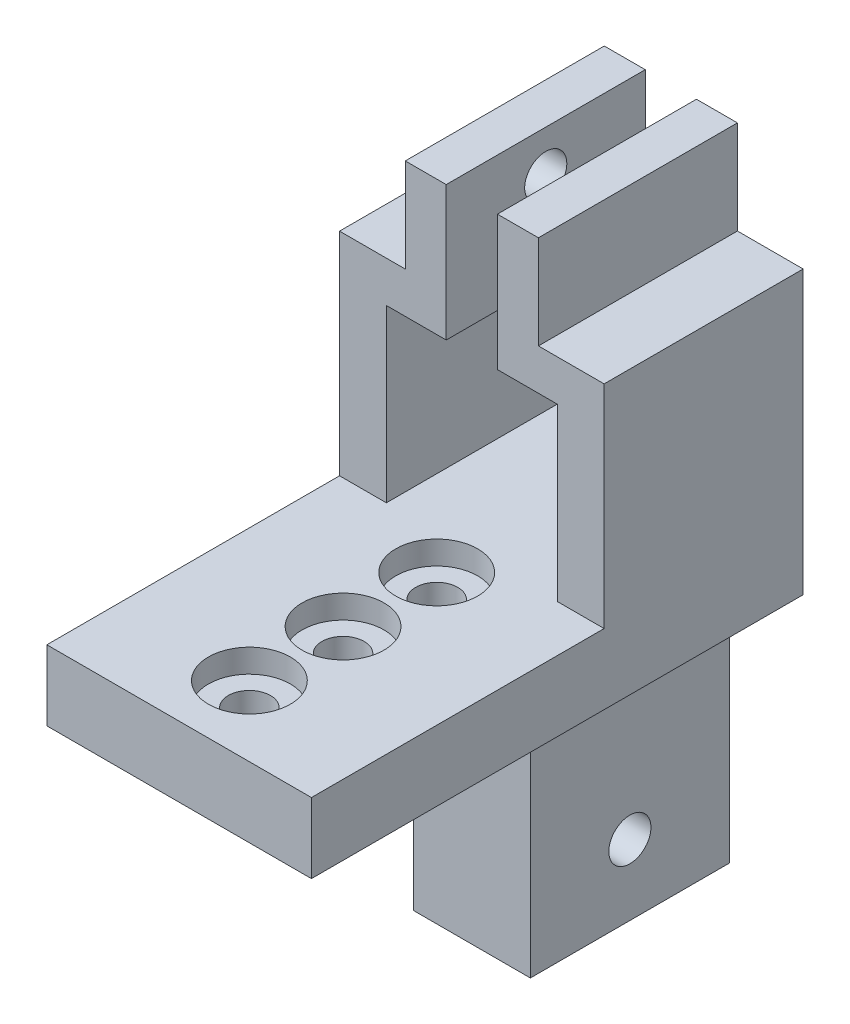
ISO-10303-21;
HEADER;
FILE_DESCRIPTION(('STEP AP214'),'2;1');
FILE_NAME('part.step','',(''),(''),'','','');
FILE_SCHEMA(('AUTOMOTIVE_DESIGN { 1 0 10303 214 1 1 1 1 }'));
ENDSEC;
DATA;
#1=APPLICATION_CONTEXT('core data for automotive mechanical design processes');
#2=APPLICATION_PROTOCOL_DEFINITION('international standard','automotive_design',2000,#1);
#3=PRODUCT_CONTEXT('',#1,'mechanical');
#4=PRODUCT('Part','Part','',(#3));
#5=PRODUCT_RELATED_PRODUCT_CATEGORY('part','',(#4));
#6=PRODUCT_DEFINITION_FORMATION('','',#4);
#7=PRODUCT_DEFINITION_CONTEXT('part definition',#1,'design');
#8=PRODUCT_DEFINITION('design','',#6,#7);
#9=PRODUCT_DEFINITION_SHAPE('','',#8);
#10=(LENGTH_UNIT() NAMED_UNIT(*) SI_UNIT(.MILLI.,.METRE.));
#11=(NAMED_UNIT(*) PLANE_ANGLE_UNIT() SI_UNIT($,.RADIAN.));
#12=(NAMED_UNIT(*) SI_UNIT($,.STERADIAN.) SOLID_ANGLE_UNIT());
#13=UNCERTAINTY_MEASURE_WITH_UNIT(LENGTH_MEASURE(1.E-05),#10,'distance_accuracy_value','');
#14=(GEOMETRIC_REPRESENTATION_CONTEXT(3) GLOBAL_UNCERTAINTY_ASSIGNED_CONTEXT((#13)) GLOBAL_UNIT_ASSIGNED_CONTEXT((#10,
#11,#12)) REPRESENTATION_CONTEXT('',''));
#15=CARTESIAN_POINT('',(0.,0.,0.));
#16=DIRECTION('',(0.,0.,1.));
#17=DIRECTION('',(1.,0.,0.));
#18=AXIS2_PLACEMENT_3D('',#15,#16,#17);
#19=CARTESIAN_POINT('',(-0.226296722125636,-34.1399860487917,20.));
#20=DIRECTION('',(0.,1.,0.));
#21=DIRECTION('',(-1.,0.,0.));
#22=AXIS2_PLACEMENT_3D('',#19,#20,#21);
#23=CYLINDRICAL_SURFACE('',#22,1.8);
#24=CARTESIAN_POINT('',(-0.226296722125634,-11.1399610487917,20.));
#25=DIRECTION('',(0.,1.,0.));
#26=DIRECTION('',(0.,0.,1.));
#27=AXIS2_PLACEMENT_3D('',#24,#25,#26);
#28=CIRCLE('',#27,1.8);
#29=CARTESIAN_POINT('',(-0.226296722125634,-11.1399610487917,21.8));
#30=VERTEX_POINT('',#29);
#31=EDGE_CURVE('E264',#30,#30,#28,.T.);
#32=ORIENTED_EDGE('',*,*,#31,.F.);
#33=EDGE_LOOP('',(#32));
#34=FACE_BOUND('',#33,.T.);
#35=CARTESIAN_POINT('',(-0.226296722125634,-7.13996104879168,20.));
#36=DIRECTION('',(0.,1.,0.));
#37=DIRECTION('',(-1.,0.,0.));
#38=AXIS2_PLACEMENT_3D('',#35,#36,#37);
#39=CIRCLE('',#38,1.8);
#40=CARTESIAN_POINT('',(-2.02629672212563,-7.13996104879168,20.));
#41=VERTEX_POINT('',#40);
#42=EDGE_CURVE('E39',#41,#41,#39,.F.);
#43=ORIENTED_EDGE('',*,*,#42,.F.);
#44=EDGE_LOOP('',(#43));
#45=FACE_BOUND('',#44,.T.);
#46=ADVANCED_FACE('F35',(#34,#45),#23,.F.);
#47=CARTESIAN_POINT('',(-0.226296722125636,-34.1399860487917,28.));
#48=DIRECTION('',(0.,1.,0.));
#49=DIRECTION('',(-1.,0.,0.));
#50=AXIS2_PLACEMENT_3D('',#47,#48,#49);
#51=CYLINDRICAL_SURFACE('',#50,1.8);
#52=CARTESIAN_POINT('',(-0.226296722125634,-11.1399610487917,28.));
#53=DIRECTION('',(0.,1.,0.));
#54=DIRECTION('',(0.,0.,1.));
#55=AXIS2_PLACEMENT_3D('',#52,#53,#54);
#56=CIRCLE('',#55,1.8);
#57=CARTESIAN_POINT('',(-0.226296722125634,-11.1399610487917,29.8));
#58=VERTEX_POINT('',#57);
#59=EDGE_CURVE('E288',#58,#58,#56,.T.);
#60=ORIENTED_EDGE('',*,*,#59,.F.);
#61=EDGE_LOOP('',(#60));
#62=FACE_BOUND('',#61,.T.);
#63=CARTESIAN_POINT('',(-0.226296722125634,-7.13996104879168,28.));
#64=DIRECTION('',(0.,1.,0.));
#65=DIRECTION('',(-1.,0.,0.));
#66=AXIS2_PLACEMENT_3D('',#63,#64,#65);
#67=CIRCLE('',#66,1.8);
#68=CARTESIAN_POINT('',(-2.02629672212563,-7.13996104879168,28.));
#69=VERTEX_POINT('',#68);
#70=EDGE_CURVE('E266',#69,#69,#67,.F.);
#71=ORIENTED_EDGE('',*,*,#70,.F.);
#72=EDGE_LOOP('',(#71));
#73=FACE_BOUND('',#72,.T.);
#74=ADVANCED_FACE('F300',(#62,#73),#51,.F.);
#75=CARTESIAN_POINT('',(-0.226296722125636,-34.1399860487917,36.));
#76=DIRECTION('',(0.,1.,0.));
#77=DIRECTION('',(-1.,0.,0.));
#78=AXIS2_PLACEMENT_3D('',#75,#76,#77);
#79=CYLINDRICAL_SURFACE('',#78,1.8);
#80=CARTESIAN_POINT('',(-0.226296722125634,-11.1399610487917,36.));
#81=DIRECTION('',(0.,1.,0.));
#82=DIRECTION('',(0.,0.,1.));
#83=AXIS2_PLACEMENT_3D('',#80,#81,#82);
#84=CIRCLE('',#83,1.8);
#85=CARTESIAN_POINT('',(-0.226296722125634,-11.1399610487917,37.8));
#86=VERTEX_POINT('',#85);
#87=EDGE_CURVE('E213',#86,#86,#84,.T.);
#88=ORIENTED_EDGE('',*,*,#87,.F.);
#89=EDGE_LOOP('',(#88));
#90=FACE_BOUND('',#89,.T.);
#91=CARTESIAN_POINT('',(-0.226296722125634,-7.13996104879168,36.));
#92=DIRECTION('',(0.,1.,0.));
#93=DIRECTION('',(-1.,0.,0.));
#94=AXIS2_PLACEMENT_3D('',#91,#92,#93);
#95=CIRCLE('',#94,1.8);
#96=CARTESIAN_POINT('',(-2.02629672212564,-7.13996104879168,36.));
#97=VERTEX_POINT('',#96);
#98=EDGE_CURVE('E262',#97,#97,#95,.F.);
#99=ORIENTED_EDGE('',*,*,#98,.F.);
#100=EDGE_LOOP('',(#99));
#101=FACE_BOUND('',#100,.T.);
#102=ADVANCED_FACE('F296',(#90,#101),#79,.F.);
#103=CARTESIAN_POINT('',(0.,0.,17.));
#104=DIRECTION('',(0.,0.,-1.));
#105=DIRECTION('',(-1.,0.,0.));
#106=AXIS2_PLACEMENT_3D('',#103,#104,#105);
#107=PLANE('',#106);
#108=DIRECTION('',(-1.,0.,0.));
#109=VECTOR('',#108,1.);
#110=CARTESIAN_POINT('',(-11.5262967221256,-5.13996104879168,17.));
#111=LINE('',#110,#109);
#112=CARTESIAN_POINT('',(11.0737032778744,-5.13996104879168,17.));
#113=VERTEX_POINT('',#112);
#114=CARTESIAN_POINT('',(7.07370327787437,-5.13996104879168,17.));
#115=VERTEX_POINT('',#114);
#116=EDGE_CURVE('E52',#113,#115,#111,.T.);
#117=ORIENTED_EDGE('',*,*,#116,.F.);
#118=DIRECTION('',(0.,1.,0.));
#119=VECTOR('',#118,1.);
#120=CARTESIAN_POINT('',(11.0737032778744,-11.1399610487917,17.));
#121=LINE('',#120,#119);
#122=CARTESIAN_POINT('',(11.0737032778744,12.9600389512083,17.));
#123=VERTEX_POINT('',#122);
#124=EDGE_CURVE('E228',#113,#123,#121,.T.);
#125=ORIENTED_EDGE('',*,*,#124,.T.);
#126=DIRECTION('',(-1.,0.,0.));
#127=VECTOR('',#126,1.);
#128=CARTESIAN_POINT('',(11.0737032778744,12.9600389512083,17.));
#129=LINE('',#128,#127);
#130=CARTESIAN_POINT('',(5.46031730207638,12.9600389512083,17.));
#131=VERTEX_POINT('',#130);
#132=EDGE_CURVE('E511',#123,#131,#129,.T.);
#133=ORIENTED_EDGE('',*,*,#132,.T.);
#134=DIRECTION('',(0.,1.,0.));
#135=VECTOR('',#134,1.);
#136=CARTESIAN_POINT('',(5.46031730207638,20.9600389512083,17.));
#137=LINE('',#136,#135);
#138=CARTESIAN_POINT('',(5.46031730207638,20.9600389512083,17.));
#139=VERTEX_POINT('',#138);
#140=EDGE_CURVE('E522',#131,#139,#137,.T.);
#141=ORIENTED_EDGE('',*,*,#140,.T.);
#142=DIRECTION('',(-1.,0.,0.));
#143=VECTOR('',#142,1.);
#144=CARTESIAN_POINT('',(1.96031730207638,20.9600389512083,17.));
#145=LINE('',#144,#143);
#146=CARTESIAN_POINT('',(1.96031730207638,20.9600389512083,17.));
#147=VERTEX_POINT('',#146);
#148=EDGE_CURVE('E519',#139,#147,#145,.T.);
#149=ORIENTED_EDGE('',*,*,#148,.T.);
#150=DIRECTION('',(0.,-1.,0.));
#151=VECTOR('',#150,1.);
#152=CARTESIAN_POINT('',(1.96031730207638,9.46003895120832,17.));
#153=LINE('',#152,#151);
#154=CARTESIAN_POINT('',(1.96031730207638,9.46003895120832,17.));
#155=VERTEX_POINT('',#154);
#156=EDGE_CURVE('E521',#147,#155,#153,.T.);
#157=ORIENTED_EDGE('',*,*,#156,.T.);
#158=DIRECTION('',(1.,0.,0.));
#159=VECTOR('',#158,1.);
#160=CARTESIAN_POINT('',(7.07370327787437,9.46003895120832,17.));
#161=LINE('',#160,#159);
#162=CARTESIAN_POINT('',(7.07370327787437,9.46003895120832,17.));
#163=VERTEX_POINT('',#162);
#164=EDGE_CURVE('E249',#155,#163,#161,.T.);
#165=ORIENTED_EDGE('',*,*,#164,.T.);
#166=DIRECTION('',(0.,-1.,0.));
#167=VECTOR('',#166,1.);
#168=CARTESIAN_POINT('',(7.07370327787437,-5.13996104879168,17.));
#169=LINE('',#168,#167);
#170=EDGE_CURVE('E245',#163,#115,#169,.T.);
#171=ORIENTED_EDGE('',*,*,#170,.T.);
#172=EDGE_LOOP('',(#117,#125,#133,#141,#149,#157,#165,#171));
#173=FACE_BOUND('',#172,.T.);
#174=ADVANCED_FACE('F299',(#173),#107,.F.);
#175=CARTESIAN_POINT('',(-7.52629672212563,-5.13996104879168,17.));
#176=VERTEX_POINT('',#175);
#177=CARTESIAN_POINT('',(-11.5262967221256,-5.13996104879168,17.));
#178=VERTEX_POINT('',#177);
#179=EDGE_CURVE('E11',#176,#178,#111,.T.);
#180=ORIENTED_EDGE('',*,*,#179,.F.);
#181=DIRECTION('',(0.,1.,0.));
#182=VECTOR('',#181,1.);
#183=CARTESIAN_POINT('',(-7.52629672212563,9.46003895120832,17.));
#184=LINE('',#183,#182);
#185=CARTESIAN_POINT('',(-7.52629672212563,9.46003895120832,17.));
#186=VERTEX_POINT('',#185);
#187=EDGE_CURVE('E243',#176,#186,#184,.T.);
#188=ORIENTED_EDGE('',*,*,#187,.T.);
#189=DIRECTION('',(1.,0.,0.));
#190=VECTOR('',#189,1.);
#191=CARTESIAN_POINT('',(-7.52629672212563,9.46003895120832,17.));
#192=LINE('',#191,#190);
#193=CARTESIAN_POINT('',(-2.41291074632765,9.46003895120832,17.));
#194=VERTEX_POINT('',#193);
#195=EDGE_CURVE('E492',#186,#194,#192,.T.);
#196=ORIENTED_EDGE('',*,*,#195,.T.);
#197=DIRECTION('',(0.,1.,0.));
#198=VECTOR('',#197,1.);
#199=CARTESIAN_POINT('',(-2.41291074632765,20.9600389512083,17.));
#200=LINE('',#199,#198);
#201=CARTESIAN_POINT('',(-2.41291074632765,20.9600389512083,17.));
#202=VERTEX_POINT('',#201);
#203=EDGE_CURVE('E544',#194,#202,#200,.T.);
#204=ORIENTED_EDGE('',*,*,#203,.T.);
#205=DIRECTION('',(-1.,0.,0.));
#206=VECTOR('',#205,1.);
#207=CARTESIAN_POINT('',(-5.91291074632765,20.9600389512083,17.));
#208=LINE('',#207,#206);
#209=CARTESIAN_POINT('',(-5.91291074632765,20.9600389512083,17.));
#210=VERTEX_POINT('',#209);
#211=EDGE_CURVE('E440',#202,#210,#208,.T.);
#212=ORIENTED_EDGE('',*,*,#211,.T.);
#213=DIRECTION('',(0.,-1.,0.));
#214=VECTOR('',#213,1.);
#215=CARTESIAN_POINT('',(-5.91291074632765,12.9600389512083,17.));
#216=LINE('',#215,#214);
#217=CARTESIAN_POINT('',(-5.91291074632765,12.9600389512083,17.));
#218=VERTEX_POINT('',#217);
#219=EDGE_CURVE('E547',#210,#218,#216,.T.);
#220=ORIENTED_EDGE('',*,*,#219,.T.);
#221=DIRECTION('',(-1.,0.,0.));
#222=VECTOR('',#221,1.);
#223=CARTESIAN_POINT('',(-5.91291074632765,12.9600389512083,17.));
#224=LINE('',#223,#222);
#225=CARTESIAN_POINT('',(-11.5262967221256,12.9600389512083,17.));
#226=VERTEX_POINT('',#225);
#227=EDGE_CURVE('E549',#218,#226,#224,.T.);
#228=ORIENTED_EDGE('',*,*,#227,.T.);
#229=DIRECTION('',(0.,-1.,0.));
#230=VECTOR('',#229,1.);
#231=CARTESIAN_POINT('',(-11.5262967221256,12.9600389512083,17.));
#232=LINE('',#231,#230);
#233=EDGE_CURVE('E60',#226,#178,#232,.T.);
#234=ORIENTED_EDGE('',*,*,#233,.T.);
#235=EDGE_LOOP('',(#180,#188,#196,#204,#212,#220,#228,#234));
#236=FACE_BOUND('',#235,.T.);
#237=ADVANCED_FACE('F357',(#236),#107,.F.);
#238=DIRECTION('',(1.,0.,0.));
#239=VECTOR('',#238,1.);
#240=CARTESIAN_POINT('',(-11.5262967221256,-11.1399610487917,17.));
#241=LINE('',#240,#239);
#242=CARTESIAN_POINT('',(-5.22629672212564,-11.1399610487917,17.));
#243=VERTEX_POINT('',#242);
#244=CARTESIAN_POINT('',(4.77370327787437,-11.1399610487917,17.));
#245=VERTEX_POINT('',#244);
#246=EDGE_CURVE('E44',#243,#245,#241,.T.);
#247=ORIENTED_EDGE('',*,*,#246,.F.);
#248=DIRECTION('',(0.,-1.,0.));
#249=VECTOR('',#248,1.);
#250=CARTESIAN_POINT('',(-5.22629672212564,-11.1399610487917,17.));
#251=LINE('',#250,#249);
#252=CARTESIAN_POINT('',(-5.22629672212563,-34.1399610487917,17.));
#253=VERTEX_POINT('',#252);
#254=EDGE_CURVE('E561',#243,#253,#251,.T.);
#255=ORIENTED_EDGE('',*,*,#254,.T.);
#256=DIRECTION('',(1.,0.,0.));
#257=VECTOR('',#256,1.);
#258=CARTESIAN_POINT('',(-5.22629672212563,-34.1399610487917,17.));
#259=LINE('',#258,#257);
#260=CARTESIAN_POINT('',(4.77370327787437,-34.1399610487917,17.));
#261=VERTEX_POINT('',#260);
#262=EDGE_CURVE('E569',#253,#261,#259,.T.);
#263=ORIENTED_EDGE('',*,*,#262,.T.);
#264=DIRECTION('',(0.,1.,0.));
#265=VECTOR('',#264,1.);
#266=CARTESIAN_POINT('',(4.77370327787437,-11.1399610487917,17.));
#267=LINE('',#266,#265);
#268=EDGE_CURVE('E565',#261,#245,#267,.T.);
#269=ORIENTED_EDGE('',*,*,#268,.T.);
#270=EDGE_LOOP('',(#247,#255,#263,#269));
#271=FACE_BOUND('',#270,.T.);
#272=ADVANCED_FACE('F358',(#271),#107,.F.);
#273=CARTESIAN_POINT('',(-7.52629672212563,9.46003895120832,17.));
#274=DIRECTION('',(0.,1.,0.));
#275=DIRECTION('',(0.,0.,1.));
#276=AXIS2_PLACEMENT_3D('',#273,#274,#275);
#277=PLANE('',#276);
#278=DIRECTION('',(1.,0.,0.));
#279=VECTOR('',#278,1.);
#280=CARTESIAN_POINT('',(-7.52629672212563,9.46003895120832,0.));
#281=LINE('',#280,#279);
#282=CARTESIAN_POINT('',(-7.52629672212563,9.46003895120832,0.));
#283=VERTEX_POINT('',#282);
#284=CARTESIAN_POINT('',(-2.41291074632765,9.46003895120832,0.));
#285=VERTEX_POINT('',#284);
#286=EDGE_CURVE('E436',#283,#285,#281,.T.);
#287=ORIENTED_EDGE('',*,*,#286,.T.);
#288=DIRECTION('',(0.,0.,-1.));
#289=VECTOR('',#288,1.);
#290=CARTESIAN_POINT('',(-2.41291074632765,9.46003895120832,17.));
#291=LINE('',#290,#289);
#292=EDGE_CURVE('E227',#194,#285,#291,.T.);
#293=ORIENTED_EDGE('',*,*,#292,.F.);
#294=ORIENTED_EDGE('',*,*,#195,.F.);
#295=DIRECTION('',(0.,0.,-1.));
#296=VECTOR('',#295,1.);
#297=CARTESIAN_POINT('',(-7.52629672212563,9.46003895120832,17.));
#298=LINE('',#297,#296);
#299=EDGE_CURVE('E240',#186,#283,#298,.T.);
#300=ORIENTED_EDGE('',*,*,#299,.T.);
#301=EDGE_LOOP('',(#287,#293,#294,#300));
#302=FACE_BOUND('',#301,.T.);
#303=ADVANCED_FACE('F37',(#302),#277,.F.);
#304=CARTESIAN_POINT('',(-2.41291074632765,20.9600389512083,17.));
#305=DIRECTION('',(-1.,0.,0.));
#306=DIRECTION('',(0.,-1.,0.));
#307=AXIS2_PLACEMENT_3D('',#304,#305,#306);
#308=PLANE('',#307);
#309=CARTESIAN_POINT('',(-2.41291074632765,17.3600389512083,8.5));
#310=DIRECTION('',(-1.,0.,0.));
#311=DIRECTION('',(0.,-1.,0.));
#312=AXIS2_PLACEMENT_3D('',#309,#310,#311);
#313=CIRCLE('',#312,1.8);
#314=CARTESIAN_POINT('',(-2.41291074632765,15.5600389512083,8.5));
#315=VERTEX_POINT('',#314);
#316=EDGE_CURVE('E424',#315,#315,#313,.T.);
#317=ORIENTED_EDGE('',*,*,#316,.T.);
#318=EDGE_LOOP('',(#317));
#319=FACE_BOUND('',#318,.T.);
#320=DIRECTION('',(0.,1.,0.));
#321=VECTOR('',#320,1.);
#322=CARTESIAN_POINT('',(-2.41291074632765,20.9600389512083,0.));
#323=LINE('',#322,#321);
#324=CARTESIAN_POINT('',(-2.41291074632765,20.9600389512083,0.));
#325=VERTEX_POINT('',#324);
#326=EDGE_CURVE('E427',#285,#325,#323,.T.);
#327=ORIENTED_EDGE('',*,*,#326,.T.);
#328=DIRECTION('',(0.,0.,-1.));
#329=VECTOR('',#328,1.);
#330=CARTESIAN_POINT('',(-2.41291074632765,20.9600389512083,17.));
#331=LINE('',#330,#329);
#332=EDGE_CURVE('E429',#202,#325,#331,.T.);
#333=ORIENTED_EDGE('',*,*,#332,.F.);
#334=ORIENTED_EDGE('',*,*,#203,.F.);
#335=ORIENTED_EDGE('',*,*,#292,.T.);
#336=EDGE_LOOP('',(#327,#333,#334,#335));
#337=FACE_BOUND('',#336,.T.);
#338=ADVANCED_FACE('F413',(#319,#337),#308,.F.);
#339=CARTESIAN_POINT('',(-5.91291074632765,20.9600389512083,17.));
#340=DIRECTION('',(0.,-1.,0.));
#341=DIRECTION('',(0.,0.,-1.));
#342=AXIS2_PLACEMENT_3D('',#339,#340,#341);
#343=PLANE('',#342);
#344=DIRECTION('',(-1.,0.,0.));
#345=VECTOR('',#344,1.);
#346=CARTESIAN_POINT('',(-5.91291074632765,20.9600389512083,0.));
#347=LINE('',#346,#345);
#348=CARTESIAN_POINT('',(-5.91291074632765,20.9600389512083,0.));
#349=VERTEX_POINT('',#348);
#350=EDGE_CURVE('E435',#325,#349,#347,.T.);
#351=ORIENTED_EDGE('',*,*,#350,.T.);
#352=DIRECTION('',(0.,0.,-1.));
#353=VECTOR('',#352,1.);
#354=CARTESIAN_POINT('',(-5.91291074632765,20.9600389512083,17.));
#355=LINE('',#354,#353);
#356=EDGE_CURVE('E441',#210,#349,#355,.T.);
#357=ORIENTED_EDGE('',*,*,#356,.F.);
#358=ORIENTED_EDGE('',*,*,#211,.F.);
#359=ORIENTED_EDGE('',*,*,#332,.T.);
#360=EDGE_LOOP('',(#351,#357,#358,#359));
#361=FACE_BOUND('',#360,.T.);
#362=ADVANCED_FACE('F410',(#361),#343,.F.);
#363=CARTESIAN_POINT('',(-5.91291074632765,12.9600389512083,17.));
#364=DIRECTION('',(1.,0.,0.));
#365=DIRECTION('',(0.,0.,-1.));
#366=AXIS2_PLACEMENT_3D('',#363,#364,#365);
#367=PLANE('',#366);
#368=CARTESIAN_POINT('',(-5.91291074632765,17.3600389512083,8.5));
#369=DIRECTION('',(1.,0.,0.));
#370=DIRECTION('',(0.,0.,-1.));
#371=AXIS2_PLACEMENT_3D('',#368,#369,#370);
#372=CIRCLE('',#371,1.8);
#373=CARTESIAN_POINT('',(-5.91291074632765,17.3600389512083,6.7));
#374=VERTEX_POINT('',#373);
#375=EDGE_CURVE('E557',#374,#374,#372,.T.);
#376=ORIENTED_EDGE('',*,*,#375,.T.);
#377=EDGE_LOOP('',(#376));
#378=FACE_BOUND('',#377,.T.);
#379=DIRECTION('',(0.,-1.,0.));
#380=VECTOR('',#379,1.);
#381=CARTESIAN_POINT('',(-5.91291074632765,12.9600389512083,0.));
#382=LINE('',#381,#380);
#383=CARTESIAN_POINT('',(-5.91291074632765,12.9600389512083,0.));
#384=VERTEX_POINT('',#383);
#385=EDGE_CURVE('E445',#349,#384,#382,.T.);
#386=ORIENTED_EDGE('',*,*,#385,.T.);
#387=DIRECTION('',(0.,0.,-1.));
#388=VECTOR('',#387,1.);
#389=CARTESIAN_POINT('',(-5.91291074632765,12.9600389512083,17.));
#390=LINE('',#389,#388);
#391=EDGE_CURVE('E466',#218,#384,#390,.T.);
#392=ORIENTED_EDGE('',*,*,#391,.F.);
#393=ORIENTED_EDGE('',*,*,#219,.F.);
#394=ORIENTED_EDGE('',*,*,#356,.T.);
#395=EDGE_LOOP('',(#386,#392,#393,#394));
#396=FACE_BOUND('',#395,.T.);
#397=ADVANCED_FACE('F406',(#378,#396),#367,.F.);
#398=CARTESIAN_POINT('',(-5.91291074632765,12.9600389512083,17.));
#399=DIRECTION('',(0.,-1.,0.));
#400=DIRECTION('',(0.,0.,-1.));
#401=AXIS2_PLACEMENT_3D('',#398,#399,#400);
#402=PLANE('',#401);
#403=DIRECTION('',(-1.,0.,0.));
#404=VECTOR('',#403,1.);
#405=CARTESIAN_POINT('',(-5.91291074632765,12.9600389512083,0.));
#406=LINE('',#405,#404);
#407=CARTESIAN_POINT('',(-11.5262967221256,12.9600389512083,0.));
#408=VERTEX_POINT('',#407);
#409=EDGE_CURVE('E447',#384,#408,#406,.T.);
#410=ORIENTED_EDGE('',*,*,#409,.T.);
#411=DIRECTION('',(0.,0.,-1.));
#412=VECTOR('',#411,1.);
#413=CARTESIAN_POINT('',(-11.5262967221256,12.9600389512083,17.));
#414=LINE('',#413,#412);
#415=EDGE_CURVE('E197',#226,#408,#414,.T.);
#416=ORIENTED_EDGE('',*,*,#415,.F.);
#417=ORIENTED_EDGE('',*,*,#227,.F.);
#418=ORIENTED_EDGE('',*,*,#391,.T.);
#419=EDGE_LOOP('',(#410,#416,#417,#418));
#420=FACE_BOUND('',#419,.T.);
#421=ADVANCED_FACE('F403',(#420),#402,.F.);
#422=CARTESIAN_POINT('',(-11.5262967221256,12.9600389512083,17.));
#423=DIRECTION('',(1.,0.,0.));
#424=DIRECTION('',(0.,1.,0.));
#425=AXIS2_PLACEMENT_3D('',#422,#423,#424);
#426=PLANE('',#425);
#427=DIRECTION('',(0.,-1.,0.));
#428=VECTOR('',#427,1.);
#429=CARTESIAN_POINT('',(-11.5262967221256,12.9600389512083,0.));
#430=LINE('',#429,#428);
#431=CARTESIAN_POINT('',(-11.5262967221256,-11.1399610487917,0.));
#432=VERTEX_POINT('',#431);
#433=EDGE_CURVE('E193',#408,#432,#430,.T.);
#434=ORIENTED_EDGE('',*,*,#433,.T.);
#435=DIRECTION('',(0.,0.,-1.));
#436=VECTOR('',#435,1.);
#437=CARTESIAN_POINT('',(-11.5262967221256,-11.1399610487917,17.));
#438=LINE('',#437,#436);
#439=CARTESIAN_POINT('',(-11.5262967221256,-11.1399610487917,42.));
#440=VERTEX_POINT('',#439);
#441=EDGE_CURVE('E185',#440,#432,#438,.T.);
#442=ORIENTED_EDGE('',*,*,#441,.F.);
#443=DIRECTION('',(0.,-1.,0.));
#444=VECTOR('',#443,1.);
#445=CARTESIAN_POINT('',(-11.5262967221256,-11.1399610487917,42.));
#446=LINE('',#445,#444);
#447=CARTESIAN_POINT('',(-11.5262967221256,-5.13996104879168,42.));
#448=VERTEX_POINT('',#447);
#449=EDGE_CURVE('E190',#448,#440,#446,.T.);
#450=ORIENTED_EDGE('',*,*,#449,.F.);
#451=DIRECTION('',(0.,0.,-1.));
#452=VECTOR('',#451,1.);
#453=CARTESIAN_POINT('',(-11.5262967221256,-5.13996104879168,42.));
#454=LINE('',#453,#452);
#455=EDGE_CURVE('E220',#448,#178,#454,.T.);
#456=ORIENTED_EDGE('',*,*,#455,.T.);
#457=ORIENTED_EDGE('',*,*,#233,.F.);
#458=ORIENTED_EDGE('',*,*,#415,.T.);
#459=EDGE_LOOP('',(#434,#442,#450,#456,#457,#458));
#460=FACE_BOUND('',#459,.T.);
#461=ADVANCED_FACE('F187',(#460),#426,.F.);
#462=CARTESIAN_POINT('',(-11.5262967221256,-11.1399610487917,17.));
#463=DIRECTION('',(0.,1.,0.));
#464=DIRECTION('',(0.,0.,1.));
#465=AXIS2_PLACEMENT_3D('',#462,#463,#464);
#466=PLANE('',#465);
#467=ORIENTED_EDGE('',*,*,#31,.T.);
#468=EDGE_LOOP('',(#467));
#469=FACE_BOUND('',#468,.T.);
#470=ORIENTED_EDGE('',*,*,#59,.T.);
#471=EDGE_LOOP('',(#470));
#472=FACE_BOUND('',#471,.T.);
#473=ORIENTED_EDGE('',*,*,#87,.T.);
#474=EDGE_LOOP('',(#473));
#475=FACE_BOUND('',#474,.T.);
#476=DIRECTION('',(1.,0.,0.));
#477=VECTOR('',#476,1.);
#478=CARTESIAN_POINT('',(-11.5262967221256,-11.1399610487917,0.));
#479=LINE('',#478,#477);
#480=CARTESIAN_POINT('',(-5.22629672212564,-11.1399610487917,0.));
#481=VERTEX_POINT('',#480);
#482=EDGE_CURVE('E462',#432,#481,#479,.T.);
#483=ORIENTED_EDGE('',*,*,#482,.T.);
#484=DIRECTION('',(0.,0.,1.));
#485=VECTOR('',#484,1.);
#486=CARTESIAN_POINT('',(-5.22629672212564,-11.1399610487917,-25.0798724079689));
#487=LINE('',#486,#485);
#488=EDGE_CURVE('E536',#481,#243,#487,.T.);
#489=ORIENTED_EDGE('',*,*,#488,.T.);
#490=ORIENTED_EDGE('',*,*,#246,.T.);
#491=DIRECTION('',(0.,0.,1.));
#492=VECTOR('',#491,1.);
#493=CARTESIAN_POINT('',(4.77370327787437,-11.1399610487917,-25.0798724079689));
#494=LINE('',#493,#492);
#495=CARTESIAN_POINT('',(4.77370327787437,-11.1399610487917,0.));
#496=VERTEX_POINT('',#495);
#497=EDGE_CURVE('E574',#496,#245,#494,.T.);
#498=ORIENTED_EDGE('',*,*,#497,.F.);
#499=CARTESIAN_POINT('',(11.0737032778744,-11.1399610487917,0.));
#500=VERTEX_POINT('',#499);
#501=EDGE_CURVE('E453',#496,#500,#479,.T.);
#502=ORIENTED_EDGE('',*,*,#501,.T.);
#503=DIRECTION('',(0.,0.,-1.));
#504=VECTOR('',#503,1.);
#505=CARTESIAN_POINT('',(11.0737032778744,-11.1399610487917,17.));
#506=LINE('',#505,#504);
#507=CARTESIAN_POINT('',(11.0737032778744,-11.1399610487917,42.));
#508=VERTEX_POINT('',#507);
#509=EDGE_CURVE('E198',#508,#500,#506,.T.);
#510=ORIENTED_EDGE('',*,*,#509,.F.);
#511=DIRECTION('',(1.,0.,0.));
#512=VECTOR('',#511,1.);
#513=CARTESIAN_POINT('',(-11.5262967221256,-11.1399610487917,42.));
#514=LINE('',#513,#512);
#515=EDGE_CURVE('E201',#440,#508,#514,.T.);
#516=ORIENTED_EDGE('',*,*,#515,.F.);
#517=ORIENTED_EDGE('',*,*,#441,.T.);
#518=EDGE_LOOP('',(#483,#489,#490,#498,#502,#510,#516,#517));
#519=FACE_BOUND('',#518,.T.);
#520=ADVANCED_FACE('F202',(#469,#472,#475,#519),#466,.F.);
#521=CARTESIAN_POINT('',(11.0737032778744,-11.1399610487917,17.));
#522=DIRECTION('',(-1.,0.,0.));
#523=DIRECTION('',(0.,-1.,0.));
#524=AXIS2_PLACEMENT_3D('',#521,#522,#523);
#525=PLANE('',#524);
#526=DIRECTION('',(0.,1.,0.));
#527=VECTOR('',#526,1.);
#528=CARTESIAN_POINT('',(11.0737032778744,-11.1399610487917,0.));
#529=LINE('',#528,#527);
#530=CARTESIAN_POINT('',(11.0737032778744,12.9600389512083,0.));
#531=VERTEX_POINT('',#530);
#532=EDGE_CURVE('E456',#500,#531,#529,.T.);
#533=ORIENTED_EDGE('',*,*,#532,.T.);
#534=DIRECTION('',(0.,0.,-1.));
#535=VECTOR('',#534,1.);
#536=CARTESIAN_POINT('',(11.0737032778744,12.9600389512083,17.));
#537=LINE('',#536,#535);
#538=EDGE_CURVE('E471',#123,#531,#537,.T.);
#539=ORIENTED_EDGE('',*,*,#538,.F.);
#540=ORIENTED_EDGE('',*,*,#124,.F.);
#541=DIRECTION('',(0.,0.,-1.));
#542=VECTOR('',#541,1.);
#543=CARTESIAN_POINT('',(11.0737032778744,-5.13996104879168,42.));
#544=LINE('',#543,#542);
#545=CARTESIAN_POINT('',(11.0737032778744,-5.13996104879168,42.));
#546=VERTEX_POINT('',#545);
#547=EDGE_CURVE('E233',#546,#113,#544,.T.);
#548=ORIENTED_EDGE('',*,*,#547,.F.);
#549=DIRECTION('',(0.,1.,0.));
#550=VECTOR('',#549,1.);
#551=CARTESIAN_POINT('',(11.0737032778744,-11.1399610487917,42.));
#552=LINE('',#551,#550);
#553=EDGE_CURVE('E206',#508,#546,#552,.T.);
#554=ORIENTED_EDGE('',*,*,#553,.F.);
#555=ORIENTED_EDGE('',*,*,#509,.T.);
#556=EDGE_LOOP('',(#533,#539,#540,#548,#554,#555));
#557=FACE_BOUND('',#556,.T.);
#558=ADVANCED_FACE('F393',(#557),#525,.F.);
#559=CARTESIAN_POINT('',(11.0737032778744,12.9600389512083,17.));
#560=DIRECTION('',(0.,-1.,0.));
#561=DIRECTION('',(1.,0.,0.));
#562=AXIS2_PLACEMENT_3D('',#559,#560,#561);
#563=PLANE('',#562);
#564=DIRECTION('',(-1.,0.,0.));
#565=VECTOR('',#564,1.);
#566=CARTESIAN_POINT('',(11.0737032778744,12.9600389512083,0.));
#567=LINE('',#566,#565);
#568=CARTESIAN_POINT('',(5.46031730207638,12.9600389512083,0.));
#569=VERTEX_POINT('',#568);
#570=EDGE_CURVE('E504',#531,#569,#567,.T.);
#571=ORIENTED_EDGE('',*,*,#570,.T.);
#572=DIRECTION('',(0.,0.,-1.));
#573=VECTOR('',#572,1.);
#574=CARTESIAN_POINT('',(5.46031730207638,12.9600389512083,17.));
#575=LINE('',#574,#573);
#576=EDGE_CURVE('E474',#131,#569,#575,.T.);
#577=ORIENTED_EDGE('',*,*,#576,.F.);
#578=ORIENTED_EDGE('',*,*,#132,.F.);
#579=ORIENTED_EDGE('',*,*,#538,.T.);
#580=EDGE_LOOP('',(#571,#577,#578,#579));
#581=FACE_BOUND('',#580,.T.);
#582=ADVANCED_FACE('F389',(#581),#563,.F.);
#583=CARTESIAN_POINT('',(5.46031730207638,20.9600389512083,17.));
#584=DIRECTION('',(-1.,0.,0.));
#585=DIRECTION('',(0.,-1.,0.));
#586=AXIS2_PLACEMENT_3D('',#583,#584,#585);
#587=PLANE('',#586);
#588=DIRECTION('',(0.,1.,0.));
#589=VECTOR('',#588,1.);
#590=CARTESIAN_POINT('',(5.46031730207638,20.9600389512083,0.));
#591=LINE('',#590,#589);
#592=CARTESIAN_POINT('',(5.46031730207638,20.9600389512083,0.));
#593=VERTEX_POINT('',#592);
#594=EDGE_CURVE('E503',#569,#593,#591,.T.);
#595=ORIENTED_EDGE('',*,*,#594,.T.);
#596=DIRECTION('',(0.,0.,-1.));
#597=VECTOR('',#596,1.);
#598=CARTESIAN_POINT('',(5.46031730207638,20.9600389512083,17.));
#599=LINE('',#598,#597);
#600=EDGE_CURVE('E477',#139,#593,#599,.T.);
#601=ORIENTED_EDGE('',*,*,#600,.F.);
#602=ORIENTED_EDGE('',*,*,#140,.F.);
#603=ORIENTED_EDGE('',*,*,#576,.T.);
#604=EDGE_LOOP('',(#595,#601,#602,#603));
#605=FACE_BOUND('',#604,.T.);
#606=ADVANCED_FACE('F385',(#605),#587,.F.);
#607=CARTESIAN_POINT('',(1.96031730207638,20.9600389512083,17.));
#608=DIRECTION('',(0.,-1.,0.));
#609=DIRECTION('',(1.,0.,0.));
#610=AXIS2_PLACEMENT_3D('',#607,#608,#609);
#611=PLANE('',#610);
#612=DIRECTION('',(-1.,0.,0.));
#613=VECTOR('',#612,1.);
#614=CARTESIAN_POINT('',(1.96031730207638,20.9600389512083,0.));
#615=LINE('',#614,#613);
#616=CARTESIAN_POINT('',(1.96031730207638,20.9600389512083,0.));
#617=VERTEX_POINT('',#616);
#618=EDGE_CURVE('E501',#593,#617,#615,.T.);
#619=ORIENTED_EDGE('',*,*,#618,.T.);
#620=DIRECTION('',(0.,0.,-1.));
#621=VECTOR('',#620,1.);
#622=CARTESIAN_POINT('',(1.96031730207638,20.9600389512083,17.));
#623=LINE('',#622,#621);
#624=EDGE_CURVE('E480',#147,#617,#623,.T.);
#625=ORIENTED_EDGE('',*,*,#624,.F.);
#626=ORIENTED_EDGE('',*,*,#148,.F.);
#627=ORIENTED_EDGE('',*,*,#600,.T.);
#628=EDGE_LOOP('',(#619,#625,#626,#627));
#629=FACE_BOUND('',#628,.T.);
#630=ADVANCED_FACE('F381',(#629),#611,.F.);
#631=CARTESIAN_POINT('',(1.96031730207638,9.46003895120832,17.));
#632=DIRECTION('',(1.,0.,0.));
#633=DIRECTION('',(0.,0.,-1.));
#634=AXIS2_PLACEMENT_3D('',#631,#632,#633);
#635=PLANE('',#634);
#636=CARTESIAN_POINT('',(1.96031730207638,17.3600389512083,8.5));
#637=DIRECTION('',(1.,0.,0.));
#638=DIRECTION('',(0.,0.,-1.));
#639=AXIS2_PLACEMENT_3D('',#636,#637,#638);
#640=CIRCLE('',#639,1.8);
#641=CARTESIAN_POINT('',(1.96031730207638,17.3600389512083,6.7));
#642=VERTEX_POINT('',#641);
#643=EDGE_CURVE('E554',#642,#642,#640,.T.);
#644=ORIENTED_EDGE('',*,*,#643,.T.);
#645=EDGE_LOOP('',(#644));
#646=FACE_BOUND('',#645,.T.);
#647=DIRECTION('',(0.,-1.,0.));
#648=VECTOR('',#647,1.);
#649=CARTESIAN_POINT('',(1.96031730207638,9.46003895120832,0.));
#650=LINE('',#649,#648);
#651=CARTESIAN_POINT('',(1.96031730207638,9.46003895120832,0.));
#652=VERTEX_POINT('',#651);
#653=EDGE_CURVE('E499',#617,#652,#650,.T.);
#654=ORIENTED_EDGE('',*,*,#653,.T.);
#655=DIRECTION('',(0.,0.,-1.));
#656=VECTOR('',#655,1.);
#657=CARTESIAN_POINT('',(1.96031730207638,9.46003895120832,17.));
#658=LINE('',#657,#656);
#659=EDGE_CURVE('E483',#155,#652,#658,.T.);
#660=ORIENTED_EDGE('',*,*,#659,.F.);
#661=ORIENTED_EDGE('',*,*,#156,.F.);
#662=ORIENTED_EDGE('',*,*,#624,.T.);
#663=EDGE_LOOP('',(#654,#660,#661,#662));
#664=FACE_BOUND('',#663,.T.);
#665=ADVANCED_FACE('F377',(#646,#664),#635,.F.);
#666=CARTESIAN_POINT('',(7.07370327787437,9.46003895120832,17.));
#667=DIRECTION('',(0.,1.,0.));
#668=DIRECTION('',(0.,0.,1.));
#669=AXIS2_PLACEMENT_3D('',#666,#667,#668);
#670=PLANE('',#669);
#671=DIRECTION('',(1.,0.,0.));
#672=VECTOR('',#671,1.);
#673=CARTESIAN_POINT('',(7.07370327787437,9.46003895120832,0.));
#674=LINE('',#673,#672);
#675=CARTESIAN_POINT('',(7.07370327787437,9.46003895120832,0.));
#676=VERTEX_POINT('',#675);
#677=EDGE_CURVE('E497',#652,#676,#674,.T.);
#678=ORIENTED_EDGE('',*,*,#677,.T.);
#679=DIRECTION('',(0.,0.,-1.));
#680=VECTOR('',#679,1.);
#681=CARTESIAN_POINT('',(7.07370327787437,9.46003895120832,17.));
#682=LINE('',#681,#680);
#683=EDGE_CURVE('E254',#163,#676,#682,.T.);
#684=ORIENTED_EDGE('',*,*,#683,.F.);
#685=ORIENTED_EDGE('',*,*,#164,.F.);
#686=ORIENTED_EDGE('',*,*,#659,.T.);
#687=EDGE_LOOP('',(#678,#684,#685,#686));
#688=FACE_BOUND('',#687,.T.);
#689=ADVANCED_FACE('F373',(#688),#670,.F.);
#690=CARTESIAN_POINT('',(7.07370327787437,-5.13996104879168,17.));
#691=DIRECTION('',(1.,0.,0.));
#692=DIRECTION('',(0.,0.,-1.));
#693=AXIS2_PLACEMENT_3D('',#690,#691,#692);
#694=PLANE('',#693);
#695=DIRECTION('',(0.,-1.,0.));
#696=VECTOR('',#695,1.);
#697=CARTESIAN_POINT('',(7.07370327787437,-5.13996104879168,0.));
#698=LINE('',#697,#696);
#699=CARTESIAN_POINT('',(7.07370327787437,-5.13996104879168,0.));
#700=VERTEX_POINT('',#699);
#701=EDGE_CURVE('E495',#676,#700,#698,.T.);
#702=ORIENTED_EDGE('',*,*,#701,.T.);
#703=DIRECTION('',(0.,0.,-1.));
#704=VECTOR('',#703,1.);
#705=CARTESIAN_POINT('',(7.07370327787437,-5.13996104879168,17.));
#706=LINE('',#705,#704);
#707=EDGE_CURVE('E239',#115,#700,#706,.T.);
#708=ORIENTED_EDGE('',*,*,#707,.F.);
#709=ORIENTED_EDGE('',*,*,#170,.F.);
#710=ORIENTED_EDGE('',*,*,#683,.T.);
#711=EDGE_LOOP('',(#702,#708,#709,#710));
#712=FACE_BOUND('',#711,.T.);
#713=ADVANCED_FACE('F369',(#712),#694,.F.);
#714=CARTESIAN_POINT('',(-7.52629672212563,-5.13996104879168,17.));
#715=DIRECTION('',(0.,-1.,0.));
#716=DIRECTION('',(1.,0.,0.));
#717=AXIS2_PLACEMENT_3D('',#714,#715,#716);
#718=PLANE('',#717);
#719=CARTESIAN_POINT('',(-0.226296722125634,-5.13996104879168,20.));
#720=DIRECTION('',(0.,1.,0.));
#721=DIRECTION('',(-1.,0.,0.));
#722=AXIS2_PLACEMENT_3D('',#719,#720,#721);
#723=CIRCLE('',#722,3.5);
#724=CARTESIAN_POINT('',(-3.72629672212563,-5.13996104879168,20.));
#725=VERTEX_POINT('',#724);
#726=EDGE_CURVE('E282',#725,#725,#723,.T.);
#727=ORIENTED_EDGE('',*,*,#726,.F.);
#728=EDGE_LOOP('',(#727));
#729=FACE_BOUND('',#728,.T.);
#730=CARTESIAN_POINT('',(-0.226296722125634,-5.13996104879168,28.));
#731=DIRECTION('',(0.,1.,0.));
#732=DIRECTION('',(-1.,0.,0.));
#733=AXIS2_PLACEMENT_3D('',#730,#731,#732);
#734=CIRCLE('',#733,3.5);
#735=CARTESIAN_POINT('',(-3.72629672212563,-5.13996104879168,28.));
#736=VERTEX_POINT('',#735);
#737=EDGE_CURVE('E275',#736,#736,#734,.T.);
#738=ORIENTED_EDGE('',*,*,#737,.F.);
#739=EDGE_LOOP('',(#738));
#740=FACE_BOUND('',#739,.T.);
#741=CARTESIAN_POINT('',(-0.226296722125634,-5.13996104879168,36.));
#742=DIRECTION('',(0.,1.,0.));
#743=DIRECTION('',(-1.,0.,0.));
#744=AXIS2_PLACEMENT_3D('',#741,#742,#743);
#745=CIRCLE('',#744,3.5);
#746=CARTESIAN_POINT('',(-3.72629672212564,-5.13996104879168,36.));
#747=VERTEX_POINT('',#746);
#748=EDGE_CURVE('E268',#747,#747,#745,.T.);
#749=ORIENTED_EDGE('',*,*,#748,.F.);
#750=EDGE_LOOP('',(#749));
#751=FACE_BOUND('',#750,.T.);
#752=DIRECTION('',(-1.,0.,0.));
#753=VECTOR('',#752,1.);
#754=CARTESIAN_POINT('',(-7.52629672212563,-5.13996104879168,0.));
#755=LINE('',#754,#753);
#756=CARTESIAN_POINT('',(-7.52629672212563,-5.13996104879168,0.));
#757=VERTEX_POINT('',#756);
#758=EDGE_CURVE('E493',#700,#757,#755,.T.);
#759=ORIENTED_EDGE('',*,*,#758,.T.);
#760=DIRECTION('',(0.,0.,-1.));
#761=VECTOR('',#760,1.);
#762=CARTESIAN_POINT('',(-7.52629672212563,-5.13996104879168,17.));
#763=LINE('',#762,#761);
#764=EDGE_CURVE('E236',#176,#757,#763,.T.);
#765=ORIENTED_EDGE('',*,*,#764,.F.);
#766=ORIENTED_EDGE('',*,*,#179,.T.);
#767=ORIENTED_EDGE('',*,*,#455,.F.);
#768=DIRECTION('',(-1.,0.,0.));
#769=VECTOR('',#768,1.);
#770=CARTESIAN_POINT('',(-11.5262967221256,-5.13996104879168,42.));
#771=LINE('',#770,#769);
#772=EDGE_CURVE('E210',#546,#448,#771,.T.);
#773=ORIENTED_EDGE('',*,*,#772,.F.);
#774=ORIENTED_EDGE('',*,*,#547,.T.);
#775=ORIENTED_EDGE('',*,*,#116,.T.);
#776=ORIENTED_EDGE('',*,*,#707,.T.);
#777=EDGE_LOOP('',(#759,#765,#766,#767,#773,#774,#775,#776));
#778=FACE_BOUND('',#777,.T.);
#779=ADVANCED_FACE('F365',(#729,#740,#751,#778),#718,.F.);
#780=CARTESIAN_POINT('',(-7.52629672212563,9.46003895120832,17.));
#781=DIRECTION('',(-1.,0.,0.));
#782=DIRECTION('',(0.,-1.,0.));
#783=AXIS2_PLACEMENT_3D('',#780,#781,#782);
#784=PLANE('',#783);
#785=DIRECTION('',(0.,1.,0.));
#786=VECTOR('',#785,1.);
#787=CARTESIAN_POINT('',(-7.52629672212563,9.46003895120832,0.));
#788=LINE('',#787,#786);
#789=EDGE_CURVE('E490',#757,#283,#788,.T.);
#790=ORIENTED_EDGE('',*,*,#789,.T.);
#791=ORIENTED_EDGE('',*,*,#299,.F.);
#792=ORIENTED_EDGE('',*,*,#187,.F.);
#793=ORIENTED_EDGE('',*,*,#764,.T.);
#794=EDGE_LOOP('',(#790,#791,#792,#793));
#795=FACE_BOUND('',#794,.T.);
#796=ADVANCED_FACE('F361',(#795),#784,.F.);
#797=CARTESIAN_POINT('',(0.,0.,0.));
#798=DIRECTION('',(0.,0.,-1.));
#799=DIRECTION('',(-1.,0.,0.));
#800=AXIS2_PLACEMENT_3D('',#797,#798,#799);
#801=PLANE('',#800);
#802=ORIENTED_EDGE('',*,*,#286,.F.);
#803=ORIENTED_EDGE('',*,*,#789,.F.);
#804=ORIENTED_EDGE('',*,*,#758,.F.);
#805=ORIENTED_EDGE('',*,*,#701,.F.);
#806=ORIENTED_EDGE('',*,*,#677,.F.);
#807=ORIENTED_EDGE('',*,*,#653,.F.);
#808=ORIENTED_EDGE('',*,*,#618,.F.);
#809=ORIENTED_EDGE('',*,*,#594,.F.);
#810=ORIENTED_EDGE('',*,*,#570,.F.);
#811=ORIENTED_EDGE('',*,*,#532,.F.);
#812=ORIENTED_EDGE('',*,*,#501,.F.);
#813=DIRECTION('',(0.,1.,0.));
#814=VECTOR('',#813,1.);
#815=CARTESIAN_POINT('',(4.77370327787437,-11.1399610487917,0.));
#816=LINE('',#815,#814);
#817=CARTESIAN_POINT('',(4.77370327787437,-34.1399610487917,0.));
#818=VERTEX_POINT('',#817);
#819=EDGE_CURVE('E572',#818,#496,#816,.T.);
#820=ORIENTED_EDGE('',*,*,#819,.F.);
#821=DIRECTION('',(1.,0.,0.));
#822=VECTOR('',#821,1.);
#823=CARTESIAN_POINT('',(-5.22629672212563,-34.1399610487917,0.));
#824=LINE('',#823,#822);
#825=CARTESIAN_POINT('',(-5.22629672212563,-34.1399610487917,0.));
#826=VERTEX_POINT('',#825);
#827=EDGE_CURVE('E568',#826,#818,#824,.T.);
#828=ORIENTED_EDGE('',*,*,#827,.F.);
#829=DIRECTION('',(0.,-1.,0.));
#830=VECTOR('',#829,1.);
#831=CARTESIAN_POINT('',(-5.22629672212564,-11.1399610487917,0.));
#832=LINE('',#831,#830);
#833=EDGE_CURVE('E529',#481,#826,#832,.T.);
#834=ORIENTED_EDGE('',*,*,#833,.F.);
#835=ORIENTED_EDGE('',*,*,#482,.F.);
#836=ORIENTED_EDGE('',*,*,#433,.F.);
#837=ORIENTED_EDGE('',*,*,#409,.F.);
#838=ORIENTED_EDGE('',*,*,#385,.F.);
#839=ORIENTED_EDGE('',*,*,#350,.F.);
#840=ORIENTED_EDGE('',*,*,#326,.F.);
#841=EDGE_LOOP('',(#802,#803,#804,#805,#806,#807,#808,#809,#810,#811,#812,#820,#828,#834,#835,
#836,#837,#838,#839,#840));
#842=FACE_BOUND('',#841,.T.);
#843=ADVANCED_FACE('F353',(#842),#801,.T.);
#844=CARTESIAN_POINT('',(-5.22629672212563,-34.1399610487917,-25.0798724079689));
#845=DIRECTION('',(0.,-1.,0.));
#846=DIRECTION('',(0.,0.,-1.));
#847=AXIS2_PLACEMENT_3D('',#844,#845,#846);
#848=PLANE('',#847);
#849=DIRECTION('',(0.,0.,1.));
#850=VECTOR('',#849,1.);
#851=CARTESIAN_POINT('',(-5.22629672212563,-34.1399610487917,-25.0798724079689));
#852=LINE('',#851,#850);
#853=EDGE_CURVE('E528',#826,#253,#852,.T.);
#854=ORIENTED_EDGE('',*,*,#853,.F.);
#855=ORIENTED_EDGE('',*,*,#827,.T.);
#856=DIRECTION('',(0.,0.,1.));
#857=VECTOR('',#856,1.);
#858=CARTESIAN_POINT('',(4.77370327787437,-34.1399610487917,-25.0798724079689));
#859=LINE('',#858,#857);
#860=EDGE_CURVE('E540',#818,#261,#859,.T.);
#861=ORIENTED_EDGE('',*,*,#860,.T.);
#862=ORIENTED_EDGE('',*,*,#262,.F.);
#863=EDGE_LOOP('',(#854,#855,#861,#862));
#864=FACE_BOUND('',#863,.T.);
#865=ADVANCED_FACE('F349',(#864),#848,.T.);
#866=CARTESIAN_POINT('',(4.77370327787437,-11.1399610487917,-25.0798724079689));
#867=DIRECTION('',(1.,0.,0.));
#868=DIRECTION('',(0.,1.,0.));
#869=AXIS2_PLACEMENT_3D('',#866,#867,#868);
#870=PLANE('',#869);
#871=CARTESIAN_POINT('',(4.77370327787437,-28.1399610487917,8.5));
#872=DIRECTION('',(1.,0.,0.));
#873=DIRECTION('',(0.,1.,0.));
#874=AXIS2_PLACEMENT_3D('',#871,#872,#873);
#875=CIRCLE('',#874,1.8);
#876=CARTESIAN_POINT('',(4.77370327787437,-26.3399610487917,8.5));
#877=VERTEX_POINT('',#876);
#878=EDGE_CURVE('E562',#877,#877,#875,.T.);
#879=ORIENTED_EDGE('',*,*,#878,.F.);
#880=EDGE_LOOP('',(#879));
#881=FACE_BOUND('',#880,.T.);
#882=ORIENTED_EDGE('',*,*,#860,.F.);
#883=ORIENTED_EDGE('',*,*,#819,.T.);
#884=ORIENTED_EDGE('',*,*,#497,.T.);
#885=ORIENTED_EDGE('',*,*,#268,.F.);
#886=EDGE_LOOP('',(#882,#883,#884,#885));
#887=FACE_BOUND('',#886,.T.);
#888=ADVANCED_FACE('F345',(#881,#887),#870,.T.);
#889=CARTESIAN_POINT('',(-5.22629672212564,-11.1399610487917,-25.0798724079689));
#890=DIRECTION('',(-1.,0.,0.));
#891=DIRECTION('',(0.,-1.,0.));
#892=AXIS2_PLACEMENT_3D('',#889,#890,#891);
#893=PLANE('',#892);
#894=CARTESIAN_POINT('',(-5.22629672212563,-28.1399610487917,8.5));
#895=DIRECTION('',(-1.,0.,0.));
#896=DIRECTION('',(0.,-1.,0.));
#897=AXIS2_PLACEMENT_3D('',#894,#895,#896);
#898=CIRCLE('',#897,1.8);
#899=CARTESIAN_POINT('',(-5.22629672212563,-29.9399610487917,8.5));
#900=VERTEX_POINT('',#899);
#901=EDGE_CURVE('E558',#900,#900,#898,.T.);
#902=ORIENTED_EDGE('',*,*,#901,.F.);
#903=EDGE_LOOP('',(#902));
#904=FACE_BOUND('',#903,.T.);
#905=ORIENTED_EDGE('',*,*,#488,.F.);
#906=ORIENTED_EDGE('',*,*,#833,.T.);
#907=ORIENTED_EDGE('',*,*,#853,.T.);
#908=ORIENTED_EDGE('',*,*,#254,.F.);
#909=EDGE_LOOP('',(#905,#906,#907,#908));
#910=FACE_BOUND('',#909,.T.);
#911=ADVANCED_FACE('F341',(#904,#910),#893,.T.);
#912=CARTESIAN_POINT('',(-11.5263217221256,-28.1399610487917,8.5));
#913=DIRECTION('',(1.,0.,0.));
#914=DIRECTION('',(0.,1.,0.));
#915=AXIS2_PLACEMENT_3D('',#912,#913,#914);
#916=CYLINDRICAL_SURFACE('',#915,1.8);
#917=ORIENTED_EDGE('',*,*,#901,.T.);
#918=EDGE_LOOP('',(#917));
#919=FACE_BOUND('',#918,.T.);
#920=ORIENTED_EDGE('',*,*,#878,.T.);
#921=EDGE_LOOP('',(#920));
#922=FACE_BOUND('',#921,.T.);
#923=ADVANCED_FACE('F334',(#919,#922),#916,.F.);
#924=CARTESIAN_POINT('',(4.77370327787437,17.3600389512083,8.5));
#925=DIRECTION('',(1.,0.,0.));
#926=DIRECTION('',(0.,1.,0.));
#927=AXIS2_PLACEMENT_3D('',#924,#925,#926);
#928=PLANE('',#927);
#929=CARTESIAN_POINT('',(4.77370327787437,17.3600389512083,8.5));
#930=DIRECTION('',(1.,0.,0.));
#931=DIRECTION('',(0.,1.,0.));
#932=AXIS2_PLACEMENT_3D('',#929,#930,#931);
#933=CIRCLE('',#932,1.8);
#934=CARTESIAN_POINT('',(4.77370327787437,19.1600389512083,8.5));
#935=VERTEX_POINT('',#934);
#936=EDGE_CURVE('E259',#935,#935,#933,.T.);
#937=ORIENTED_EDGE('',*,*,#936,.F.);
#938=EDGE_LOOP('',(#937));
#939=FACE_BOUND('',#938,.T.);
#940=ADVANCED_FACE('F330',(#939),#928,.F.);
#941=CARTESIAN_POINT('',(-11.5263217221256,17.3600389512083,8.5));
#942=DIRECTION('',(1.,0.,0.));
#943=DIRECTION('',(0.,1.,0.));
#944=AXIS2_PLACEMENT_3D('',#941,#942,#943);
#945=CYLINDRICAL_SURFACE('',#944,1.8);
#946=ORIENTED_EDGE('',*,*,#936,.T.);
#947=EDGE_LOOP('',(#946));
#948=FACE_BOUND('',#947,.T.);
#949=ORIENTED_EDGE('',*,*,#643,.F.);
#950=EDGE_LOOP('',(#949));
#951=FACE_BOUND('',#950,.T.);
#952=ADVANCED_FACE('F333',(#948,#951),#945,.F.);
#953=ORIENTED_EDGE('',*,*,#375,.F.);
#954=EDGE_LOOP('',(#953));
#955=FACE_BOUND('',#954,.T.);
#956=ORIENTED_EDGE('',*,*,#316,.F.);
#957=EDGE_LOOP('',(#956));
#958=FACE_BOUND('',#957,.T.);
#959=ADVANCED_FACE('F316',(#955,#958),#945,.F.);
#960=CARTESIAN_POINT('',(0.,0.,42.));
#961=DIRECTION('',(0.,0.,-1.));
#962=DIRECTION('',(-1.,0.,0.));
#963=AXIS2_PLACEMENT_3D('',#960,#961,#962);
#964=PLANE('',#963);
#965=ORIENTED_EDGE('',*,*,#449,.T.);
#966=ORIENTED_EDGE('',*,*,#515,.T.);
#967=ORIENTED_EDGE('',*,*,#553,.T.);
#968=ORIENTED_EDGE('',*,*,#772,.T.);
#969=EDGE_LOOP('',(#965,#966,#967,#968));
#970=FACE_BOUND('',#969,.T.);
#971=ADVANCED_FACE('F208',(#970),#964,.F.);
#972=CARTESIAN_POINT('',(-0.226296722125634,-7.13996104879168,36.));
#973=DIRECTION('',(0.,1.,0.));
#974=DIRECTION('',(-1.,0.,0.));
#975=AXIS2_PLACEMENT_3D('',#972,#973,#974);
#976=PLANE('',#975);
#977=CARTESIAN_POINT('',(-0.226296722125634,-7.13996104879168,36.));
#978=DIRECTION('',(0.,1.,0.));
#979=DIRECTION('',(-1.,0.,0.));
#980=AXIS2_PLACEMENT_3D('',#977,#978,#979);
#981=CIRCLE('',#980,3.5);
#982=CARTESIAN_POINT('',(-3.72629672212564,-7.13996104879168,36.));
#983=VERTEX_POINT('',#982);
#984=EDGE_CURVE('E265',#983,#983,#981,.T.);
#985=ORIENTED_EDGE('',*,*,#984,.T.);
#986=EDGE_LOOP('',(#985));
#987=FACE_BOUND('',#986,.T.);
#988=ORIENTED_EDGE('',*,*,#98,.T.);
#989=EDGE_LOOP('',(#988));
#990=FACE_BOUND('',#989,.T.);
#991=ADVANCED_FACE('F304',(#987,#990),#976,.T.);
#992=CARTESIAN_POINT('',(-0.226296722125634,-7.13996104879168,36.));
#993=DIRECTION('',(0.,1.,0.));
#994=DIRECTION('',(-1.,0.,0.));
#995=AXIS2_PLACEMENT_3D('',#992,#993,#994);
#996=CYLINDRICAL_SURFACE('',#995,3.5);
#997=ORIENTED_EDGE('',*,*,#984,.F.);
#998=EDGE_LOOP('',(#997));
#999=FACE_BOUND('',#998,.T.);
#1000=ORIENTED_EDGE('',*,*,#748,.T.);
#1001=EDGE_LOOP('',(#1000));
#1002=FACE_BOUND('',#1001,.T.);
#1003=ADVANCED_FACE('F306',(#999,#1002),#996,.F.);
#1004=CARTESIAN_POINT('',(-0.226296722125634,-7.13996104879168,28.));
#1005=DIRECTION('',(0.,1.,0.));
#1006=DIRECTION('',(-1.,0.,0.));
#1007=AXIS2_PLACEMENT_3D('',#1004,#1005,#1006);
#1008=PLANE('',#1007);
#1009=CARTESIAN_POINT('',(-0.226296722125634,-7.13996104879168,28.));
#1010=DIRECTION('',(0.,1.,0.));
#1011=DIRECTION('',(-1.,0.,0.));
#1012=AXIS2_PLACEMENT_3D('',#1009,#1010,#1011);
#1013=CIRCLE('',#1012,3.5);
#1014=CARTESIAN_POINT('',(-3.72629672212563,-7.13996104879168,28.));
#1015=VERTEX_POINT('',#1014);
#1016=EDGE_CURVE('E269',#1015,#1015,#1013,.T.);
#1017=ORIENTED_EDGE('',*,*,#1016,.T.);
#1018=EDGE_LOOP('',(#1017));
#1019=FACE_BOUND('',#1018,.T.);
#1020=ORIENTED_EDGE('',*,*,#70,.T.);
#1021=EDGE_LOOP('',(#1020));
#1022=FACE_BOUND('',#1021,.T.);
#1023=ADVANCED_FACE('F313',(#1019,#1022),#1008,.T.);
#1024=CARTESIAN_POINT('',(-0.226296722125634,-7.13996104879168,28.));
#1025=DIRECTION('',(0.,1.,0.));
#1026=DIRECTION('',(-1.,0.,0.));
#1027=AXIS2_PLACEMENT_3D('',#1024,#1025,#1026);
#1028=CYLINDRICAL_SURFACE('',#1027,3.5);
#1029=ORIENTED_EDGE('',*,*,#1016,.F.);
#1030=EDGE_LOOP('',(#1029));
#1031=FACE_BOUND('',#1030,.T.);
#1032=ORIENTED_EDGE('',*,*,#737,.T.);
#1033=EDGE_LOOP('',(#1032));
#1034=FACE_BOUND('',#1033,.T.);
#1035=ADVANCED_FACE('F849',(#1031,#1034),#1028,.F.);
#1036=CARTESIAN_POINT('',(-0.226296722125634,-7.13996104879168,20.));
#1037=DIRECTION('',(0.,1.,0.));
#1038=DIRECTION('',(-1.,0.,0.));
#1039=AXIS2_PLACEMENT_3D('',#1036,#1037,#1038);
#1040=PLANE('',#1039);
#1041=CARTESIAN_POINT('',(-0.226296722125634,-7.13996104879168,20.));
#1042=DIRECTION('',(0.,1.,0.));
#1043=DIRECTION('',(-1.,0.,0.));
#1044=AXIS2_PLACEMENT_3D('',#1041,#1042,#1043);
#1045=CIRCLE('',#1044,3.5);
#1046=CARTESIAN_POINT('',(-3.72629672212563,-7.13996104879168,20.));
#1047=VERTEX_POINT('',#1046);
#1048=EDGE_CURVE('E884',#1047,#1047,#1045,.T.);
#1049=ORIENTED_EDGE('',*,*,#1048,.T.);
#1050=EDGE_LOOP('',(#1049));
#1051=FACE_BOUND('',#1050,.T.);
#1052=ORIENTED_EDGE('',*,*,#42,.T.);
#1053=EDGE_LOOP('',(#1052));
#1054=FACE_BOUND('',#1053,.T.);
#1055=ADVANCED_FACE('F858',(#1051,#1054),#1040,.T.);
#1056=CARTESIAN_POINT('',(-0.226296722125634,-7.13996104879168,20.));
#1057=DIRECTION('',(0.,1.,0.));
#1058=DIRECTION('',(-1.,0.,0.));
#1059=AXIS2_PLACEMENT_3D('',#1056,#1057,#1058);
#1060=CYLINDRICAL_SURFACE('',#1059,3.5);
#1061=ORIENTED_EDGE('',*,*,#1048,.F.);
#1062=EDGE_LOOP('',(#1061));
#1063=FACE_BOUND('',#1062,.T.);
#1064=ORIENTED_EDGE('',*,*,#726,.T.);
#1065=EDGE_LOOP('',(#1064));
#1066=FACE_BOUND('',#1065,.T.);
#1067=ADVANCED_FACE('F867',(#1063,#1066),#1060,.F.);
#1068=CLOSED_SHELL('',(#46,#74,#102,#174,#237,#272,#303,#338,#362,#397,#421,#461,#520,#558,#582,
#606,#630,#665,#689,#713,#779,#796,#843,#865,#888,#911,#923,#940,#952,#959,#971,#991,#1003,
#1023,#1035,#1055,#1067));
#1069=MANIFOLD_SOLID_BREP('B2',#1068);
#1070=ADVANCED_BREP_SHAPE_REPRESENTATION('',(#18,#1069),#14);
#1071=SHAPE_DEFINITION_REPRESENTATION(#9,#1070);
ENDSEC;
END-ISO-10303-21;
